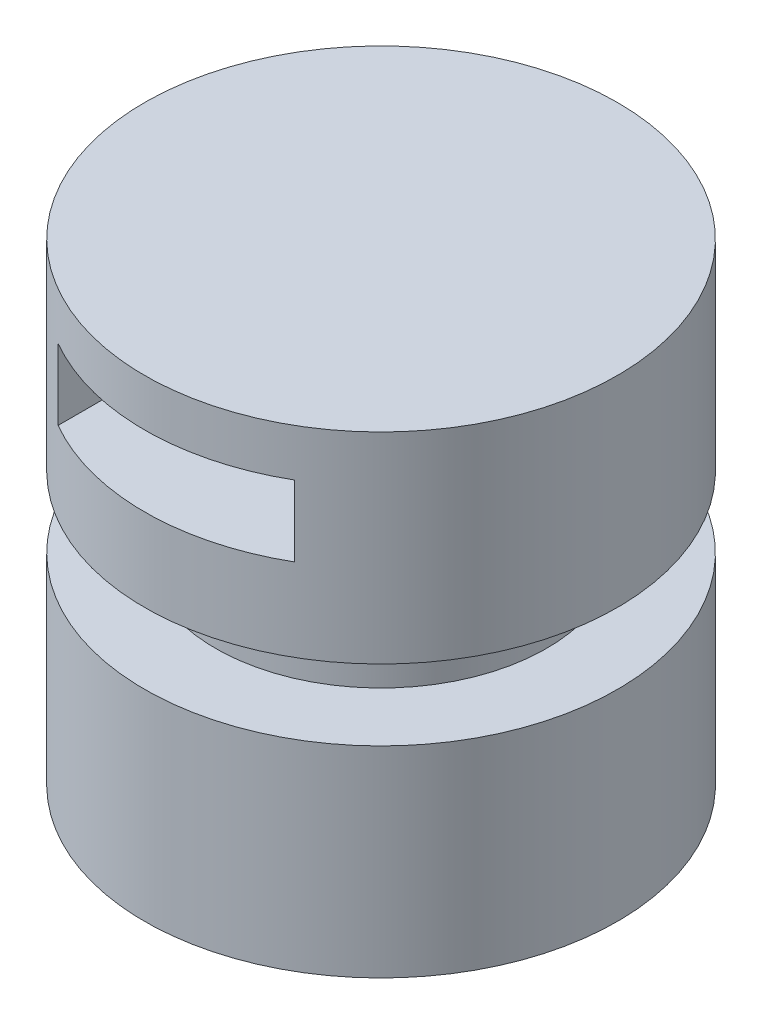
ISO-10303-21;
HEADER;
FILE_DESCRIPTION(('STEP AP214'),'2;1');
FILE_NAME('part.step','',(''),(''),'','','');
FILE_SCHEMA(('AUTOMOTIVE_DESIGN { 1 0 10303 214 1 1 1 1 }'));
ENDSEC;
DATA;
#1=APPLICATION_CONTEXT('core data for automotive mechanical design processes');
#2=APPLICATION_PROTOCOL_DEFINITION('international standard','automotive_design',2000,#1);
#3=PRODUCT_CONTEXT('',#1,'mechanical');
#4=PRODUCT('Part','Part','',(#3));
#5=PRODUCT_RELATED_PRODUCT_CATEGORY('part','',(#4));
#6=PRODUCT_DEFINITION_FORMATION('','',#4);
#7=PRODUCT_DEFINITION_CONTEXT('part definition',#1,'design');
#8=PRODUCT_DEFINITION('design','',#6,#7);
#9=PRODUCT_DEFINITION_SHAPE('','',#8);
#10=(LENGTH_UNIT() NAMED_UNIT(*) SI_UNIT(.MILLI.,.METRE.));
#11=(NAMED_UNIT(*) PLANE_ANGLE_UNIT() SI_UNIT($,.RADIAN.));
#12=(NAMED_UNIT(*) SI_UNIT($,.STERADIAN.) SOLID_ANGLE_UNIT());
#13=UNCERTAINTY_MEASURE_WITH_UNIT(LENGTH_MEASURE(1.E-05),#10,'distance_accuracy_value','');
#14=(GEOMETRIC_REPRESENTATION_CONTEXT(3) GLOBAL_UNCERTAINTY_ASSIGNED_CONTEXT((#13)) GLOBAL_UNIT_ASSIGNED_CONTEXT((#10,
#11,#12)) REPRESENTATION_CONTEXT('',''));
#15=CARTESIAN_POINT('',(0.,0.,0.));
#16=DIRECTION('',(0.,0.,1.));
#17=DIRECTION('',(1.,0.,0.));
#18=AXIS2_PLACEMENT_3D('',#15,#16,#17);
#19=CARTESIAN_POINT('',(0.,0.,0.));
#20=DIRECTION('',(0.,-1.,0.));
#21=DIRECTION('',(0.,0.,-1.));
#22=AXIS2_PLACEMENT_3D('',#19,#20,#21);
#23=CYLINDRICAL_SURFACE('',#22,2540.);
#24=CARTESIAN_POINT('',(0.,2159.,-3.77475828372553E-13));
#25=DIRECTION('',(0.,-1.,0.));
#26=DIRECTION('',(0.,0.,-1.));
#27=AXIS2_PLACEMENT_3D('',#24,#25,#26);
#28=CIRCLE('',#27,2540.);
#29=CARTESIAN_POINT('',(0.,2159.,-2540.));
#30=VERTEX_POINT('',#29);
#31=EDGE_CURVE('E122',#30,#30,#28,.T.);
#32=ORIENTED_EDGE('',*,*,#31,.T.);
#33=EDGE_LOOP('',(#32));
#34=FACE_BOUND('',#33,.T.);
#35=CARTESIAN_POINT('',(0.,0.,0.));
#36=DIRECTION('',(0.,-1.,0.));
#37=DIRECTION('',(0.,0.,-1.));
#38=AXIS2_PLACEMENT_3D('',#35,#36,#37);
#39=CIRCLE('',#38,2540.);
#40=CARTESIAN_POINT('',(0.,0.,-2540.));
#41=VERTEX_POINT('',#40);
#42=EDGE_CURVE('E126',#41,#41,#39,.T.);
#43=ORIENTED_EDGE('',*,*,#42,.F.);
#44=EDGE_LOOP('',(#43));
#45=FACE_BOUND('',#44,.T.);
#46=ADVANCED_FACE('F39',(#34,#45),#23,.T.);
#47=CARTESIAN_POINT('',(0.,0.,0.));
#48=DIRECTION('',(0.,-1.,0.));
#49=DIRECTION('',(0.,0.,-1.));
#50=AXIS2_PLACEMENT_3D('',#47,#48,#49);
#51=PLANE('',#50);
#52=ORIENTED_EDGE('',*,*,#42,.T.);
#53=EDGE_LOOP('',(#52));
#54=FACE_BOUND('',#53,.T.);
#55=ADVANCED_FACE('F164',(#54),#51,.T.);
#56=CARTESIAN_POINT('',(0.,2159.,-2540.));
#57=DIRECTION('',(0.,-1.,0.));
#58=DIRECTION('',(0.,0.,-1.));
#59=AXIS2_PLACEMENT_3D('',#56,#57,#58);
#60=PLANE('',#59);
#61=ORIENTED_EDGE('',*,*,#31,.F.);
#62=EDGE_LOOP('',(#61));
#63=FACE_BOUND('',#62,.T.);
#64=CARTESIAN_POINT('',(0.,2159.,-3.77475828372553E-13));
#65=DIRECTION('',(0.,-1.,0.));
#66=DIRECTION('',(0.,0.,-1.));
#67=AXIS2_PLACEMENT_3D('',#64,#65,#66);
#68=CIRCLE('',#67,1778.);
#69=CARTESIAN_POINT('',(0.,2159.,-1778.));
#70=VERTEX_POINT('',#69);
#71=EDGE_CURVE('E118',#70,#70,#68,.T.);
#72=ORIENTED_EDGE('',*,*,#71,.T.);
#73=EDGE_LOOP('',(#72));
#74=FACE_BOUND('',#73,.T.);
#75=ADVANCED_FACE('F169',(#63,#74),#60,.F.);
#76=CARTESIAN_POINT('',(0.,0.,0.));
#77=DIRECTION('',(0.,-1.,0.));
#78=DIRECTION('',(0.,0.,-1.));
#79=AXIS2_PLACEMENT_3D('',#76,#77,#78);
#80=CYLINDRICAL_SURFACE('',#79,1778.);
#81=ORIENTED_EDGE('',*,*,#71,.F.);
#82=EDGE_LOOP('',(#81));
#83=FACE_BOUND('',#82,.T.);
#84=CARTESIAN_POINT('',(0.,2921.,-5.10702591327572E-13));
#85=DIRECTION('',(0.,-1.,0.));
#86=DIRECTION('',(0.,0.,-1.));
#87=AXIS2_PLACEMENT_3D('',#84,#85,#86);
#88=CIRCLE('',#87,1778.);
#89=CARTESIAN_POINT('',(0.,2921.,-1778.));
#90=VERTEX_POINT('',#89);
#91=EDGE_CURVE('E114',#90,#90,#88,.T.);
#92=ORIENTED_EDGE('',*,*,#91,.T.);
#93=EDGE_LOOP('',(#92));
#94=FACE_BOUND('',#93,.T.);
#95=ADVANCED_FACE('F160',(#83,#94),#80,.T.);
#96=CARTESIAN_POINT('',(0.,2921.,-2540.));
#97=DIRECTION('',(0.,1.,0.));
#98=DIRECTION('',(0.,0.,1.));
#99=AXIS2_PLACEMENT_3D('',#96,#97,#98);
#100=PLANE('',#99);
#101=ORIENTED_EDGE('',*,*,#91,.F.);
#102=EDGE_LOOP('',(#101));
#103=FACE_BOUND('',#102,.T.);
#104=CARTESIAN_POINT('',(0.,2921.,-5.10702591327572E-13));
#105=DIRECTION('',(0.,-1.,0.));
#106=DIRECTION('',(0.,0.,-1.));
#107=AXIS2_PLACEMENT_3D('',#104,#105,#106);
#108=CIRCLE('',#107,2540.);
#109=CARTESIAN_POINT('',(0.,2921.,-2540.));
#110=VERTEX_POINT('',#109);
#111=EDGE_CURVE('E110',#110,#110,#108,.T.);
#112=ORIENTED_EDGE('',*,*,#111,.T.);
#113=EDGE_LOOP('',(#112));
#114=FACE_BOUND('',#113,.T.);
#115=ADVANCED_FACE('F156',(#103,#114),#100,.F.);
#116=CARTESIAN_POINT('',(0.,5080.,0.));
#117=DIRECTION('',(0.,1.,0.));
#118=DIRECTION('',(0.,0.,1.));
#119=AXIS2_PLACEMENT_3D('',#116,#117,#118);
#120=PLANE('',#119);
#121=CARTESIAN_POINT('',(0.,5080.,0.));
#122=DIRECTION('',(0.,-1.,0.));
#123=DIRECTION('',(0.,0.,-1.));
#124=AXIS2_PLACEMENT_3D('',#121,#122,#123);
#125=CIRCLE('',#124,2540.);
#126=CARTESIAN_POINT('',(0.,5080.,-2540.));
#127=VERTEX_POINT('',#126);
#128=EDGE_CURVE('E130',#127,#127,#125,.T.);
#129=ORIENTED_EDGE('',*,*,#128,.F.);
#130=EDGE_LOOP('',(#129));
#131=FACE_BOUND('',#130,.T.);
#132=ADVANCED_FACE('F41',(#131),#120,.T.);
#133=CARTESIAN_POINT('',(0.,3810.,0.));
#134=DIRECTION('',(0.,-1.,0.));
#135=DIRECTION('',(1.,0.,0.));
#136=AXIS2_PLACEMENT_3D('',#133,#134,#135);
#137=CIRCLE('',#136,2540.);
#138=CARTESIAN_POINT('',(1270.,3810.,-2199.70452561247));
#139=VERTEX_POINT('',#138);
#140=CARTESIAN_POINT('',(-1270.,3810.,-2199.70452561247));
#141=VERTEX_POINT('',#140);
#142=EDGE_CURVE('E81',#139,#141,#137,.F.);
#143=ORIENTED_EDGE('',*,*,#142,.F.);
#144=DIRECTION('',(0.,-1.,0.));
#145=VECTOR('',#144,1.);
#146=CARTESIAN_POINT('',(1270.,-7.40148683083437E-13,-2199.70452561248));
#147=LINE('',#146,#145);
#148=CARTESIAN_POINT('',(1270.,4572.,-2199.70452561248));
#149=VERTEX_POINT('',#148);
#150=EDGE_CURVE('E11',#149,#139,#147,.T.);
#151=ORIENTED_EDGE('',*,*,#150,.F.);
#152=CARTESIAN_POINT('',(0.,4572.,0.));
#153=DIRECTION('',(0.,1.,0.));
#154=DIRECTION('',(0.,0.,1.));
#155=AXIS2_PLACEMENT_3D('',#152,#153,#154);
#156=CIRCLE('',#155,2540.);
#157=CARTESIAN_POINT('',(-1270.,4572.,-2199.70452561247));
#158=VERTEX_POINT('',#157);
#159=EDGE_CURVE('E63',#158,#149,#156,.F.);
#160=ORIENTED_EDGE('',*,*,#159,.F.);
#161=DIRECTION('',(0.,-1.,0.));
#162=VECTOR('',#161,1.);
#163=CARTESIAN_POINT('',(-1270.,0.,-2199.70452561247));
#164=LINE('',#163,#162);
#165=EDGE_CURVE('E48',#141,#158,#164,.F.);
#166=ORIENTED_EDGE('',*,*,#165,.F.);
#167=EDGE_LOOP('',(#143,#151,#160,#166));
#168=FACE_BOUND('',#167,.T.);
#169=CARTESIAN_POINT('',(-1270.,3810.,2199.70452561247));
#170=VERTEX_POINT('',#169);
#171=CARTESIAN_POINT('',(1270.,3810.,2199.70452561247));
#172=VERTEX_POINT('',#171);
#173=EDGE_CURVE('E91',#170,#172,#137,.F.);
#174=ORIENTED_EDGE('',*,*,#173,.F.);
#175=DIRECTION('',(0.,-1.,0.));
#176=VECTOR('',#175,1.);
#177=CARTESIAN_POINT('',(-1270.,0.,2199.70452561247));
#178=LINE('',#177,#176);
#179=CARTESIAN_POINT('',(-1270.,4572.,2199.70452561247));
#180=VERTEX_POINT('',#179);
#181=EDGE_CURVE('E89',#180,#170,#178,.T.);
#182=ORIENTED_EDGE('',*,*,#181,.F.);
#183=CARTESIAN_POINT('',(1270.,4572.,2199.70452561247));
#184=VERTEX_POINT('',#183);
#185=EDGE_CURVE('E55',#184,#180,#156,.F.);
#186=ORIENTED_EDGE('',*,*,#185,.F.);
#187=DIRECTION('',(0.,-1.,0.));
#188=VECTOR('',#187,1.);
#189=CARTESIAN_POINT('',(1270.,-7.40148683083437E-13,2199.70452561248));
#190=LINE('',#189,#188);
#191=EDGE_CURVE('E135',#172,#184,#190,.F.);
#192=ORIENTED_EDGE('',*,*,#191,.F.);
#193=EDGE_LOOP('',(#174,#182,#186,#192));
#194=FACE_BOUND('',#193,.T.);
#195=ORIENTED_EDGE('',*,*,#111,.F.);
#196=EDGE_LOOP('',(#195));
#197=FACE_BOUND('',#196,.T.);
#198=ORIENTED_EDGE('',*,*,#128,.T.);
#199=EDGE_LOOP('',(#198));
#200=FACE_BOUND('',#199,.T.);
#201=ADVANCED_FACE('F82',(#168,#194,#197,#200),#23,.T.);
#202=CARTESIAN_POINT('',(-1270.,4572.,-2540.));
#203=DIRECTION('',(-1.,0.,0.));
#204=DIRECTION('',(0.,0.,1.));
#205=AXIS2_PLACEMENT_3D('',#202,#203,#204);
#206=PLANE('',#205);
#207=ORIENTED_EDGE('',*,*,#165,.T.);
#208=DIRECTION('',(0.,0.,1.));
#209=VECTOR('',#208,1.);
#210=CARTESIAN_POINT('',(-1270.,4572.,-2540.));
#211=LINE('',#210,#209);
#212=EDGE_CURVE('E105',#158,#180,#211,.T.);
#213=ORIENTED_EDGE('',*,*,#212,.T.);
#214=ORIENTED_EDGE('',*,*,#181,.T.);
#215=DIRECTION('',(0.,0.,1.));
#216=VECTOR('',#215,1.);
#217=CARTESIAN_POINT('',(-1270.,3810.,-2540.));
#218=LINE('',#217,#216);
#219=EDGE_CURVE('E101',#141,#170,#218,.T.);
#220=ORIENTED_EDGE('',*,*,#219,.F.);
#221=EDGE_LOOP('',(#207,#213,#214,#220));
#222=FACE_BOUND('',#221,.T.);
#223=ADVANCED_FACE('F148',(#222),#206,.F.);
#224=CARTESIAN_POINT('',(-1270.,4572.,-2540.));
#225=DIRECTION('',(0.,1.,0.));
#226=DIRECTION('',(0.,0.,1.));
#227=AXIS2_PLACEMENT_3D('',#224,#225,#226);
#228=PLANE('',#227);
#229=ORIENTED_EDGE('',*,*,#212,.F.);
#230=ORIENTED_EDGE('',*,*,#159,.T.);
#231=DIRECTION('',(0.,0.,1.));
#232=VECTOR('',#231,1.);
#233=CARTESIAN_POINT('',(1270.,4572.,-2540.));
#234=LINE('',#233,#232);
#235=EDGE_CURVE('E98',#149,#184,#234,.T.);
#236=ORIENTED_EDGE('',*,*,#235,.T.);
#237=ORIENTED_EDGE('',*,*,#185,.T.);
#238=EDGE_LOOP('',(#229,#230,#236,#237));
#239=FACE_BOUND('',#238,.T.);
#240=ADVANCED_FACE('F145',(#239),#228,.F.);
#241=CARTESIAN_POINT('',(1270.,4572.,-2540.));
#242=DIRECTION('',(1.,0.,0.));
#243=DIRECTION('',(0.,1.,0.));
#244=AXIS2_PLACEMENT_3D('',#241,#242,#243);
#245=PLANE('',#244);
#246=ORIENTED_EDGE('',*,*,#191,.T.);
#247=ORIENTED_EDGE('',*,*,#235,.F.);
#248=ORIENTED_EDGE('',*,*,#150,.T.);
#249=DIRECTION('',(0.,0.,1.));
#250=VECTOR('',#249,1.);
#251=CARTESIAN_POINT('',(1270.,3810.,-2540.));
#252=LINE('',#251,#250);
#253=EDGE_CURVE('E96',#139,#172,#252,.T.);
#254=ORIENTED_EDGE('',*,*,#253,.T.);
#255=EDGE_LOOP('',(#246,#247,#248,#254));
#256=FACE_BOUND('',#255,.T.);
#257=ADVANCED_FACE('F95',(#256),#245,.F.);
#258=CARTESIAN_POINT('',(-1270.,3810.,-2540.));
#259=DIRECTION('',(0.,-1.,0.));
#260=DIRECTION('',(1.,0.,0.));
#261=AXIS2_PLACEMENT_3D('',#258,#259,#260);
#262=PLANE('',#261);
#263=ORIENTED_EDGE('',*,*,#253,.F.);
#264=ORIENTED_EDGE('',*,*,#142,.T.);
#265=ORIENTED_EDGE('',*,*,#219,.T.);
#266=ORIENTED_EDGE('',*,*,#173,.T.);
#267=EDGE_LOOP('',(#263,#264,#265,#266));
#268=FACE_BOUND('',#267,.T.);
#269=ADVANCED_FACE('F99',(#268),#262,.F.);
#270=CLOSED_SHELL('',(#46,#55,#75,#95,#115,#132,#201,#223,#240,#257,#269));
#271=MANIFOLD_SOLID_BREP('B2',#270);
#272=ADVANCED_BREP_SHAPE_REPRESENTATION('',(#18,#271),#14);
#273=SHAPE_DEFINITION_REPRESENTATION(#9,#272);
ENDSEC;
END-ISO-10303-21;
